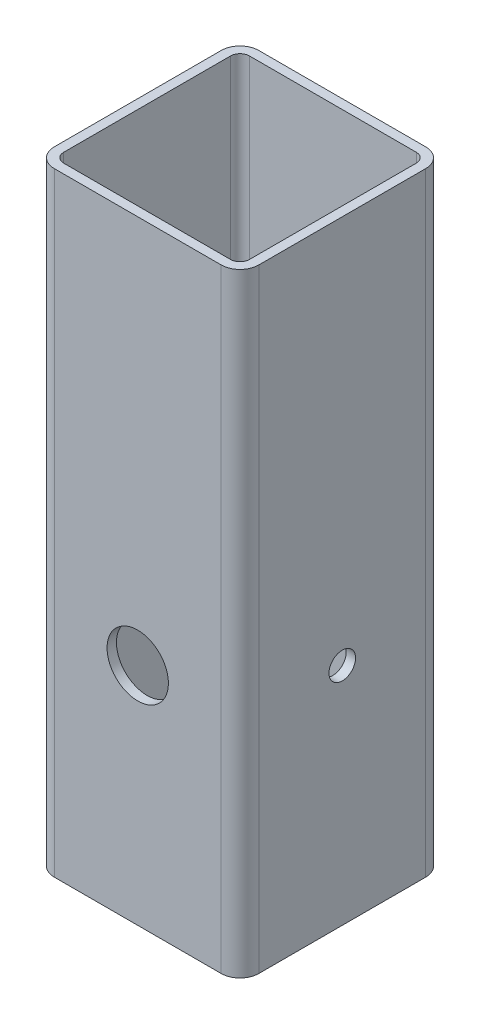
ISO-10303-21;
HEADER;
FILE_DESCRIPTION(('STEP AP214'),'2;1');
FILE_NAME('part.step','',(''),(''),'','','');
FILE_SCHEMA(('AUTOMOTIVE_DESIGN { 1 0 10303 214 1 1 1 1 }'));
ENDSEC;
DATA;
#1=APPLICATION_CONTEXT('core data for automotive mechanical design processes');
#2=APPLICATION_PROTOCOL_DEFINITION('international standard','automotive_design',2000,#1);
#3=PRODUCT_CONTEXT('',#1,'mechanical');
#4=PRODUCT('Part','Part','',(#3));
#5=PRODUCT_RELATED_PRODUCT_CATEGORY('part','',(#4));
#6=PRODUCT_DEFINITION_FORMATION('','',#4);
#7=PRODUCT_DEFINITION_CONTEXT('part definition',#1,'design');
#8=PRODUCT_DEFINITION('design','',#6,#7);
#9=PRODUCT_DEFINITION_SHAPE('','',#8);
#10=(LENGTH_UNIT() NAMED_UNIT(*) SI_UNIT(.MILLI.,.METRE.));
#11=(NAMED_UNIT(*) PLANE_ANGLE_UNIT() SI_UNIT($,.RADIAN.));
#12=(NAMED_UNIT(*) SI_UNIT($,.STERADIAN.) SOLID_ANGLE_UNIT());
#13=UNCERTAINTY_MEASURE_WITH_UNIT(LENGTH_MEASURE(1.E-05),#10,'distance_accuracy_value','');
#14=(GEOMETRIC_REPRESENTATION_CONTEXT(3) GLOBAL_UNCERTAINTY_ASSIGNED_CONTEXT((#13)) GLOBAL_UNIT_ASSIGNED_CONTEXT((#10,
#11,#12)) REPRESENTATION_CONTEXT('',''));
#15=CARTESIAN_POINT('',(0.,0.,0.));
#16=DIRECTION('',(0.,0.,1.));
#17=DIRECTION('',(1.,0.,0.));
#18=AXIS2_PLACEMENT_3D('',#15,#16,#17);
#19=CARTESIAN_POINT('',(20.4,75.,-20.4));
#20=DIRECTION('',(0.,-1.,0.));
#21=DIRECTION('',(0.,0.,-1.));
#22=AXIS2_PLACEMENT_3D('',#19,#20,#21);
#23=CYLINDRICAL_SURFACE('',#22,2.3);
#24=CARTESIAN_POINT('',(20.4,-75.,-20.4));
#25=DIRECTION('',(0.,1.,0.));
#26=DIRECTION('',(0.,0.,-1.));
#27=AXIS2_PLACEMENT_3D('',#24,#25,#26);
#28=CIRCLE('',#27,2.3);
#29=CARTESIAN_POINT('',(22.7,-75.,-20.4));
#30=VERTEX_POINT('',#29);
#31=CARTESIAN_POINT('',(20.4,-75.,-22.7));
#32=VERTEX_POINT('',#31);
#33=EDGE_CURVE('E229',#30,#32,#28,.T.);
#34=ORIENTED_EDGE('',*,*,#33,.F.);
#35=DIRECTION('',(0.,-1.,0.));
#36=VECTOR('',#35,1.);
#37=CARTESIAN_POINT('',(22.7,75.,-20.4));
#38=LINE('',#37,#36);
#39=CARTESIAN_POINT('',(22.7,75.,-20.4));
#40=VERTEX_POINT('',#39);
#41=EDGE_CURVE('E12',#40,#30,#38,.T.);
#42=ORIENTED_EDGE('',*,*,#41,.F.);
#43=CARTESIAN_POINT('',(20.4,75.,-20.4));
#44=DIRECTION('',(0.,1.,0.));
#45=DIRECTION('',(0.,0.,-1.));
#46=AXIS2_PLACEMENT_3D('',#43,#44,#45);
#47=CIRCLE('',#46,2.3);
#48=CARTESIAN_POINT('',(20.4,75.,-22.7));
#49=VERTEX_POINT('',#48);
#50=EDGE_CURVE('E316',#40,#49,#47,.T.);
#51=ORIENTED_EDGE('',*,*,#50,.T.);
#52=DIRECTION('',(0.,-1.,0.));
#53=VECTOR('',#52,1.);
#54=CARTESIAN_POINT('',(20.4,75.,-22.7));
#55=LINE('',#54,#53);
#56=EDGE_CURVE('E80',#49,#32,#55,.T.);
#57=ORIENTED_EDGE('',*,*,#56,.T.);
#58=EDGE_LOOP('',(#34,#42,#51,#57));
#59=FACE_BOUND('',#58,.T.);
#60=ADVANCED_FACE('F61',(#59),#23,.F.);
#61=CARTESIAN_POINT('',(22.7,75.,-20.4));
#62=DIRECTION('',(-1.,0.,0.));
#63=DIRECTION('',(0.,0.,1.));
#64=AXIS2_PLACEMENT_3D('',#61,#62,#63);
#65=PLANE('',#64);
#66=CARTESIAN_POINT('',(22.7,-20.,0.));
#67=DIRECTION('',(-1.,0.,0.));
#68=DIRECTION('',(0.,0.,1.));
#69=AXIS2_PLACEMENT_3D('',#66,#67,#68);
#70=CIRCLE('',#69,3.25);
#71=CARTESIAN_POINT('',(22.7,-20.,3.25));
#72=VERTEX_POINT('',#71);
#73=EDGE_CURVE('E215',#72,#72,#70,.T.);
#74=ORIENTED_EDGE('',*,*,#73,.F.);
#75=EDGE_LOOP('',(#74));
#76=FACE_BOUND('',#75,.T.);
#77=DIRECTION('',(0.,0.,-1.));
#78=VECTOR('',#77,1.);
#79=CARTESIAN_POINT('',(22.7,-75.,-20.4));
#80=LINE('',#79,#78);
#81=CARTESIAN_POINT('',(22.7,-75.,20.4));
#82=VERTEX_POINT('',#81);
#83=EDGE_CURVE('E231',#82,#30,#80,.T.);
#84=ORIENTED_EDGE('',*,*,#83,.F.);
#85=DIRECTION('',(0.,-1.,0.));
#86=VECTOR('',#85,1.);
#87=CARTESIAN_POINT('',(22.7,75.,20.4));
#88=LINE('',#87,#86);
#89=CARTESIAN_POINT('',(22.7,75.,20.4));
#90=VERTEX_POINT('',#89);
#91=EDGE_CURVE('E71',#90,#82,#88,.T.);
#92=ORIENTED_EDGE('',*,*,#91,.F.);
#93=DIRECTION('',(0.,0.,-1.));
#94=VECTOR('',#93,1.);
#95=CARTESIAN_POINT('',(22.7,75.,-20.4));
#96=LINE('',#95,#94);
#97=EDGE_CURVE('E318',#90,#40,#96,.T.);
#98=ORIENTED_EDGE('',*,*,#97,.T.);
#99=ORIENTED_EDGE('',*,*,#41,.T.);
#100=EDGE_LOOP('',(#84,#92,#98,#99));
#101=FACE_BOUND('',#100,.T.);
#102=ADVANCED_FACE('F349',(#76,#101),#65,.T.);
#103=CARTESIAN_POINT('',(20.4,75.,20.4));
#104=DIRECTION('',(0.,-1.,0.));
#105=DIRECTION('',(0.,0.,-1.));
#106=AXIS2_PLACEMENT_3D('',#103,#104,#105);
#107=CYLINDRICAL_SURFACE('',#106,2.3);
#108=CARTESIAN_POINT('',(20.4,-75.,20.4));
#109=DIRECTION('',(0.,1.,0.));
#110=DIRECTION('',(0.,0.,-1.));
#111=AXIS2_PLACEMENT_3D('',#108,#109,#110);
#112=CIRCLE('',#111,2.3);
#113=CARTESIAN_POINT('',(20.4,-75.,22.7));
#114=VERTEX_POINT('',#113);
#115=EDGE_CURVE('E234',#114,#82,#112,.T.);
#116=ORIENTED_EDGE('',*,*,#115,.F.);
#117=DIRECTION('',(0.,-1.,0.));
#118=VECTOR('',#117,1.);
#119=CARTESIAN_POINT('',(20.4,75.,22.7));
#120=LINE('',#119,#118);
#121=CARTESIAN_POINT('',(20.4,75.,22.7));
#122=VERTEX_POINT('',#121);
#123=EDGE_CURVE('E256',#122,#114,#120,.T.);
#124=ORIENTED_EDGE('',*,*,#123,.F.);
#125=CARTESIAN_POINT('',(20.4,75.,20.4));
#126=DIRECTION('',(0.,1.,0.));
#127=DIRECTION('',(0.,0.,-1.));
#128=AXIS2_PLACEMENT_3D('',#125,#126,#127);
#129=CIRCLE('',#128,2.3);
#130=EDGE_CURVE('E321',#122,#90,#129,.T.);
#131=ORIENTED_EDGE('',*,*,#130,.T.);
#132=ORIENTED_EDGE('',*,*,#91,.T.);
#133=EDGE_LOOP('',(#116,#124,#131,#132));
#134=FACE_BOUND('',#133,.T.);
#135=ADVANCED_FACE('F355',(#134),#107,.F.);
#136=CARTESIAN_POINT('',(-20.4,75.,22.7));
#137=DIRECTION('',(0.,0.,-1.));
#138=DIRECTION('',(-1.,0.,0.));
#139=AXIS2_PLACEMENT_3D('',#136,#137,#138);
#140=PLANE('',#139);
#141=CARTESIAN_POINT('',(0.,-20.,22.7));
#142=DIRECTION('',(0.,0.,-1.));
#143=DIRECTION('',(-1.,0.,0.));
#144=AXIS2_PLACEMENT_3D('',#141,#142,#143);
#145=CIRCLE('',#144,7.5);
#146=CARTESIAN_POINT('',(-7.5,-20.,22.7));
#147=VERTEX_POINT('',#146);
#148=EDGE_CURVE('E384',#147,#147,#145,.T.);
#149=ORIENTED_EDGE('',*,*,#148,.F.);
#150=EDGE_LOOP('',(#149));
#151=FACE_BOUND('',#150,.T.);
#152=DIRECTION('',(1.,0.,0.));
#153=VECTOR('',#152,1.);
#154=CARTESIAN_POINT('',(-20.4,-75.,22.7));
#155=LINE('',#154,#153);
#156=CARTESIAN_POINT('',(-20.4,-75.,22.7));
#157=VERTEX_POINT('',#156);
#158=EDGE_CURVE('E237',#157,#114,#155,.T.);
#159=ORIENTED_EDGE('',*,*,#158,.F.);
#160=DIRECTION('',(0.,-1.,0.));
#161=VECTOR('',#160,1.);
#162=CARTESIAN_POINT('',(-20.4,75.,22.7));
#163=LINE('',#162,#161);
#164=CARTESIAN_POINT('',(-20.4,75.,22.7));
#165=VERTEX_POINT('',#164);
#166=EDGE_CURVE('E254',#165,#157,#163,.T.);
#167=ORIENTED_EDGE('',*,*,#166,.F.);
#168=DIRECTION('',(1.,0.,0.));
#169=VECTOR('',#168,1.);
#170=CARTESIAN_POINT('',(-20.4,75.,22.7));
#171=LINE('',#170,#169);
#172=EDGE_CURVE('E324',#165,#122,#171,.T.);
#173=ORIENTED_EDGE('',*,*,#172,.T.);
#174=ORIENTED_EDGE('',*,*,#123,.T.);
#175=EDGE_LOOP('',(#159,#167,#173,#174));
#176=FACE_BOUND('',#175,.T.);
#177=ADVANCED_FACE('F417',(#151,#176),#140,.T.);
#178=CARTESIAN_POINT('',(-20.4,75.,20.4));
#179=DIRECTION('',(0.,-1.,0.));
#180=DIRECTION('',(0.,0.,-1.));
#181=AXIS2_PLACEMENT_3D('',#178,#179,#180);
#182=CYLINDRICAL_SURFACE('',#181,2.3);
#183=CARTESIAN_POINT('',(-20.4,-75.,20.4));
#184=DIRECTION('',(0.,1.,0.));
#185=DIRECTION('',(0.,0.,1.));
#186=AXIS2_PLACEMENT_3D('',#183,#184,#185);
#187=CIRCLE('',#186,2.3);
#188=CARTESIAN_POINT('',(-22.7,-75.,20.4));
#189=VERTEX_POINT('',#188);
#190=EDGE_CURVE('E240',#189,#157,#187,.T.);
#191=ORIENTED_EDGE('',*,*,#190,.F.);
#192=DIRECTION('',(0.,-1.,0.));
#193=VECTOR('',#192,1.);
#194=CARTESIAN_POINT('',(-22.7,75.,20.4));
#195=LINE('',#194,#193);
#196=CARTESIAN_POINT('',(-22.7,75.,20.4));
#197=VERTEX_POINT('',#196);
#198=EDGE_CURVE('E191',#197,#189,#195,.T.);
#199=ORIENTED_EDGE('',*,*,#198,.F.);
#200=CARTESIAN_POINT('',(-20.4,75.,20.4));
#201=DIRECTION('',(0.,1.,0.));
#202=DIRECTION('',(0.,0.,1.));
#203=AXIS2_PLACEMENT_3D('',#200,#201,#202);
#204=CIRCLE('',#203,2.3);
#205=EDGE_CURVE('E202',#197,#165,#204,.T.);
#206=ORIENTED_EDGE('',*,*,#205,.T.);
#207=ORIENTED_EDGE('',*,*,#166,.T.);
#208=EDGE_LOOP('',(#191,#199,#206,#207));
#209=FACE_BOUND('',#208,.T.);
#210=ADVANCED_FACE('F328',(#209),#182,.F.);
#211=CARTESIAN_POINT('',(-22.7,75.,-20.4));
#212=DIRECTION('',(1.,0.,0.));
#213=DIRECTION('',(0.,0.,-1.));
#214=AXIS2_PLACEMENT_3D('',#211,#212,#213);
#215=PLANE('',#214);
#216=CARTESIAN_POINT('',(-22.7,-20.,0.));
#217=DIRECTION('',(1.,0.,0.));
#218=DIRECTION('',(0.,0.,-1.));
#219=AXIS2_PLACEMENT_3D('',#216,#217,#218);
#220=CIRCLE('',#219,7.5);
#221=CARTESIAN_POINT('',(-22.7,-20.,-7.5));
#222=VERTEX_POINT('',#221);
#223=EDGE_CURVE('E605',#222,#222,#220,.T.);
#224=ORIENTED_EDGE('',*,*,#223,.F.);
#225=EDGE_LOOP('',(#224));
#226=FACE_BOUND('',#225,.T.);
#227=DIRECTION('',(0.,0.,1.));
#228=VECTOR('',#227,1.);
#229=CARTESIAN_POINT('',(-22.7,-75.,-20.4));
#230=LINE('',#229,#228);
#231=CARTESIAN_POINT('',(-22.7,-75.,-20.4));
#232=VERTEX_POINT('',#231);
#233=EDGE_CURVE('E187',#232,#189,#230,.T.);
#234=ORIENTED_EDGE('',*,*,#233,.F.);
#235=DIRECTION('',(0.,-1.,0.));
#236=VECTOR('',#235,1.);
#237=CARTESIAN_POINT('',(-22.7,75.,-20.4));
#238=LINE('',#237,#236);
#239=CARTESIAN_POINT('',(-22.7,75.,-20.4));
#240=VERTEX_POINT('',#239);
#241=EDGE_CURVE('E182',#240,#232,#238,.T.);
#242=ORIENTED_EDGE('',*,*,#241,.F.);
#243=DIRECTION('',(0.,0.,1.));
#244=VECTOR('',#243,1.);
#245=CARTESIAN_POINT('',(-22.7,75.,-20.4));
#246=LINE('',#245,#244);
#247=EDGE_CURVE('E185',#240,#197,#246,.T.);
#248=ORIENTED_EDGE('',*,*,#247,.T.);
#249=ORIENTED_EDGE('',*,*,#198,.T.);
#250=EDGE_LOOP('',(#234,#242,#248,#249));
#251=FACE_BOUND('',#250,.T.);
#252=ADVANCED_FACE('F184',(#226,#251),#215,.T.);
#253=CARTESIAN_POINT('',(-20.4,75.,-20.4));
#254=DIRECTION('',(0.,-1.,0.));
#255=DIRECTION('',(0.,0.,-1.));
#256=AXIS2_PLACEMENT_3D('',#253,#254,#255);
#257=CYLINDRICAL_SURFACE('',#256,2.3);
#258=CARTESIAN_POINT('',(-20.4,-75.,-20.4));
#259=DIRECTION('',(0.,1.,0.));
#260=DIRECTION('',(0.,0.,-1.));
#261=AXIS2_PLACEMENT_3D('',#258,#259,#260);
#262=CIRCLE('',#261,2.3);
#263=CARTESIAN_POINT('',(-20.4,-75.,-22.7));
#264=VERTEX_POINT('',#263);
#265=EDGE_CURVE('E244',#264,#232,#262,.T.);
#266=ORIENTED_EDGE('',*,*,#265,.F.);
#267=DIRECTION('',(0.,-1.,0.));
#268=VECTOR('',#267,1.);
#269=CARTESIAN_POINT('',(-20.4,75.,-22.7));
#270=LINE('',#269,#268);
#271=CARTESIAN_POINT('',(-20.4,75.,-22.7));
#272=VERTEX_POINT('',#271);
#273=EDGE_CURVE('E129',#272,#264,#270,.T.);
#274=ORIENTED_EDGE('',*,*,#273,.F.);
#275=CARTESIAN_POINT('',(-20.4,75.,-20.4));
#276=DIRECTION('',(0.,1.,0.));
#277=DIRECTION('',(0.,0.,-1.));
#278=AXIS2_PLACEMENT_3D('',#275,#276,#277);
#279=CIRCLE('',#278,2.3);
#280=EDGE_CURVE('E199',#272,#240,#279,.T.);
#281=ORIENTED_EDGE('',*,*,#280,.T.);
#282=ORIENTED_EDGE('',*,*,#241,.T.);
#283=EDGE_LOOP('',(#266,#274,#281,#282));
#284=FACE_BOUND('',#283,.T.);
#285=ADVANCED_FACE('F204',(#284),#257,.F.);
#286=CARTESIAN_POINT('',(20.4,75.,-20.4));
#287=DIRECTION('',(0.,-1.,0.));
#288=DIRECTION('',(0.,0.,-1.));
#289=AXIS2_PLACEMENT_3D('',#286,#287,#288);
#290=CYLINDRICAL_SURFACE('',#289,4.6);
#291=CARTESIAN_POINT('',(20.4,-75.,-20.4));
#292=DIRECTION('',(0.,1.,0.));
#293=DIRECTION('',(0.,0.,-1.));
#294=AXIS2_PLACEMENT_3D('',#291,#292,#293);
#295=CIRCLE('',#294,4.6);
#296=CARTESIAN_POINT('',(25.,-75.,-20.4));
#297=VERTEX_POINT('',#296);
#298=CARTESIAN_POINT('',(20.4,-75.,-25.));
#299=VERTEX_POINT('',#298);
#300=EDGE_CURVE('E211',#297,#299,#295,.T.);
#301=ORIENTED_EDGE('',*,*,#300,.T.);
#302=DIRECTION('',(0.,-1.,0.));
#303=VECTOR('',#302,1.);
#304=CARTESIAN_POINT('',(20.4,75.,-25.));
#305=LINE('',#304,#303);
#306=CARTESIAN_POINT('',(20.4,75.,-25.));
#307=VERTEX_POINT('',#306);
#308=EDGE_CURVE('E251',#307,#299,#305,.T.);
#309=ORIENTED_EDGE('',*,*,#308,.F.);
#310=CARTESIAN_POINT('',(20.4,75.,-20.4));
#311=DIRECTION('',(0.,1.,0.));
#312=DIRECTION('',(0.,0.,-1.));
#313=AXIS2_PLACEMENT_3D('',#310,#311,#312);
#314=CIRCLE('',#313,4.6);
#315=CARTESIAN_POINT('',(25.,75.,-20.4));
#316=VERTEX_POINT('',#315);
#317=EDGE_CURVE('E249',#316,#307,#314,.T.);
#318=ORIENTED_EDGE('',*,*,#317,.F.);
#319=DIRECTION('',(0.,-1.,0.));
#320=VECTOR('',#319,1.);
#321=CARTESIAN_POINT('',(25.,75.,-20.4));
#322=LINE('',#321,#320);
#323=EDGE_CURVE('E207',#316,#297,#322,.T.);
#324=ORIENTED_EDGE('',*,*,#323,.T.);
#325=EDGE_LOOP('',(#301,#309,#318,#324));
#326=FACE_BOUND('',#325,.T.);
#327=ADVANCED_FACE('F63',(#326),#290,.T.);
#328=CARTESIAN_POINT('',(-20.4,75.,-25.));
#329=DIRECTION('',(0.,0.,1.));
#330=DIRECTION('',(1.,0.,0.));
#331=AXIS2_PLACEMENT_3D('',#328,#329,#330);
#332=PLANE('',#331);
#333=CARTESIAN_POINT('',(0.,-20.,-25.));
#334=DIRECTION('',(0.,0.,-1.));
#335=DIRECTION('',(-1.,0.,0.));
#336=AXIS2_PLACEMENT_3D('',#333,#334,#335);
#337=CIRCLE('',#336,3.25);
#338=CARTESIAN_POINT('',(-3.25,-20.,-25.));
#339=VERTEX_POINT('',#338);
#340=EDGE_CURVE('E382',#339,#339,#337,.T.);
#341=ORIENTED_EDGE('',*,*,#340,.F.);
#342=EDGE_LOOP('',(#341));
#343=FACE_BOUND('',#342,.T.);
#344=DIRECTION('',(-1.,0.,0.));
#345=VECTOR('',#344,1.);
#346=CARTESIAN_POINT('',(-20.4,-75.,-25.));
#347=LINE('',#346,#345);
#348=CARTESIAN_POINT('',(-20.4,-75.,-25.));
#349=VERTEX_POINT('',#348);
#350=EDGE_CURVE('E214',#299,#349,#347,.T.);
#351=ORIENTED_EDGE('',*,*,#350,.T.);
#352=DIRECTION('',(0.,-1.,0.));
#353=VECTOR('',#352,1.);
#354=CARTESIAN_POINT('',(-20.4,75.,-25.));
#355=LINE('',#354,#353);
#356=CARTESIAN_POINT('',(-20.4,75.,-25.));
#357=VERTEX_POINT('',#356);
#358=EDGE_CURVE('E276',#357,#349,#355,.T.);
#359=ORIENTED_EDGE('',*,*,#358,.F.);
#360=DIRECTION('',(-1.,0.,0.));
#361=VECTOR('',#360,1.);
#362=CARTESIAN_POINT('',(-20.4,75.,-25.));
#363=LINE('',#362,#361);
#364=EDGE_CURVE('E142',#307,#357,#363,.T.);
#365=ORIENTED_EDGE('',*,*,#364,.F.);
#366=ORIENTED_EDGE('',*,*,#308,.T.);
#367=EDGE_LOOP('',(#351,#359,#365,#366));
#368=FACE_BOUND('',#367,.T.);
#369=ADVANCED_FACE('F279',(#343,#368),#332,.F.);
#370=CARTESIAN_POINT('',(-20.4,75.,-20.4));
#371=DIRECTION('',(0.,-1.,0.));
#372=DIRECTION('',(0.,0.,-1.));
#373=AXIS2_PLACEMENT_3D('',#370,#371,#372);
#374=CYLINDRICAL_SURFACE('',#373,4.6);
#375=CARTESIAN_POINT('',(-20.4,-75.,-20.4));
#376=DIRECTION('',(0.,1.,0.));
#377=DIRECTION('',(0.,0.,-1.));
#378=AXIS2_PLACEMENT_3D('',#375,#376,#377);
#379=CIRCLE('',#378,4.6);
#380=CARTESIAN_POINT('',(-25.,-75.,-20.4));
#381=VERTEX_POINT('',#380);
#382=EDGE_CURVE('E217',#349,#381,#379,.T.);
#383=ORIENTED_EDGE('',*,*,#382,.T.);
#384=DIRECTION('',(0.,-1.,0.));
#385=VECTOR('',#384,1.);
#386=CARTESIAN_POINT('',(-25.,75.,-20.4));
#387=LINE('',#386,#385);
#388=CARTESIAN_POINT('',(-25.,75.,-20.4));
#389=VERTEX_POINT('',#388);
#390=EDGE_CURVE('E273',#389,#381,#387,.T.);
#391=ORIENTED_EDGE('',*,*,#390,.F.);
#392=CARTESIAN_POINT('',(-20.4,75.,-20.4));
#393=DIRECTION('',(0.,1.,0.));
#394=DIRECTION('',(0.,0.,-1.));
#395=AXIS2_PLACEMENT_3D('',#392,#393,#394);
#396=CIRCLE('',#395,4.6);
#397=EDGE_CURVE('E304',#357,#389,#396,.T.);
#398=ORIENTED_EDGE('',*,*,#397,.F.);
#399=ORIENTED_EDGE('',*,*,#358,.T.);
#400=EDGE_LOOP('',(#383,#391,#398,#399));
#401=FACE_BOUND('',#400,.T.);
#402=ADVANCED_FACE('F294',(#401),#374,.T.);
#403=CARTESIAN_POINT('',(-25.,75.,-20.4));
#404=DIRECTION('',(1.,0.,0.));
#405=DIRECTION('',(0.,0.,-1.));
#406=AXIS2_PLACEMENT_3D('',#403,#404,#405);
#407=PLANE('',#406);
#408=CARTESIAN_POINT('',(-25.,-20.,0.));
#409=DIRECTION('',(-1.,0.,0.));
#410=DIRECTION('',(0.,0.,1.));
#411=AXIS2_PLACEMENT_3D('',#408,#409,#410);
#412=CIRCLE('',#411,7.5);
#413=CARTESIAN_POINT('',(-25.,-20.,7.5));
#414=VERTEX_POINT('',#413);
#415=EDGE_CURVE('E608',#414,#414,#412,.T.);
#416=ORIENTED_EDGE('',*,*,#415,.F.);
#417=EDGE_LOOP('',(#416));
#418=FACE_BOUND('',#417,.T.);
#419=DIRECTION('',(0.,0.,1.));
#420=VECTOR('',#419,1.);
#421=CARTESIAN_POINT('',(-25.,-75.,-20.4));
#422=LINE('',#421,#420);
#423=CARTESIAN_POINT('',(-25.,-75.,20.4));
#424=VERTEX_POINT('',#423);
#425=EDGE_CURVE('E219',#381,#424,#422,.T.);
#426=ORIENTED_EDGE('',*,*,#425,.T.);
#427=DIRECTION('',(0.,-1.,0.));
#428=VECTOR('',#427,1.);
#429=CARTESIAN_POINT('',(-25.,75.,20.4));
#430=LINE('',#429,#428);
#431=CARTESIAN_POINT('',(-25.,75.,20.4));
#432=VERTEX_POINT('',#431);
#433=EDGE_CURVE('E270',#432,#424,#430,.T.);
#434=ORIENTED_EDGE('',*,*,#433,.F.);
#435=DIRECTION('',(0.,0.,1.));
#436=VECTOR('',#435,1.);
#437=CARTESIAN_POINT('',(-25.,75.,-20.4));
#438=LINE('',#437,#436);
#439=EDGE_CURVE('E300',#389,#432,#438,.T.);
#440=ORIENTED_EDGE('',*,*,#439,.F.);
#441=ORIENTED_EDGE('',*,*,#390,.T.);
#442=EDGE_LOOP('',(#426,#434,#440,#441));
#443=FACE_BOUND('',#442,.T.);
#444=ADVANCED_FACE('F298',(#418,#443),#407,.F.);
#445=CARTESIAN_POINT('',(-20.4,75.,20.4));
#446=DIRECTION('',(0.,-1.,0.));
#447=DIRECTION('',(0.,0.,-1.));
#448=AXIS2_PLACEMENT_3D('',#445,#446,#447);
#449=CYLINDRICAL_SURFACE('',#448,4.6);
#450=CARTESIAN_POINT('',(-20.4,-75.,20.4));
#451=DIRECTION('',(0.,1.,0.));
#452=DIRECTION('',(0.,0.,1.));
#453=AXIS2_PLACEMENT_3D('',#450,#451,#452);
#454=CIRCLE('',#453,4.6);
#455=CARTESIAN_POINT('',(-20.4,-75.,25.));
#456=VERTEX_POINT('',#455);
#457=EDGE_CURVE('E221',#424,#456,#454,.T.);
#458=ORIENTED_EDGE('',*,*,#457,.T.);
#459=DIRECTION('',(0.,-1.,0.));
#460=VECTOR('',#459,1.);
#461=CARTESIAN_POINT('',(-20.4,75.,25.));
#462=LINE('',#461,#460);
#463=CARTESIAN_POINT('',(-20.4,75.,25.));
#464=VERTEX_POINT('',#463);
#465=EDGE_CURVE('E267',#464,#456,#462,.T.);
#466=ORIENTED_EDGE('',*,*,#465,.F.);
#467=CARTESIAN_POINT('',(-20.4,75.,20.4));
#468=DIRECTION('',(0.,1.,0.));
#469=DIRECTION('',(0.,0.,1.));
#470=AXIS2_PLACEMENT_3D('',#467,#468,#469);
#471=CIRCLE('',#470,4.6);
#472=EDGE_CURVE('E303',#432,#464,#471,.T.);
#473=ORIENTED_EDGE('',*,*,#472,.F.);
#474=ORIENTED_EDGE('',*,*,#433,.T.);
#475=EDGE_LOOP('',(#458,#466,#473,#474));
#476=FACE_BOUND('',#475,.T.);
#477=ADVANCED_FACE('F366',(#476),#449,.T.);
#478=CARTESIAN_POINT('',(-20.4,75.,25.));
#479=DIRECTION('',(0.,0.,-1.));
#480=DIRECTION('',(-1.,0.,0.));
#481=AXIS2_PLACEMENT_3D('',#478,#479,#480);
#482=PLANE('',#481);
#483=CARTESIAN_POINT('',(0.,-20.,25.));
#484=DIRECTION('',(0.,0.,1.));
#485=DIRECTION('',(1.,0.,0.));
#486=AXIS2_PLACEMENT_3D('',#483,#484,#485);
#487=CIRCLE('',#486,7.5);
#488=CARTESIAN_POINT('',(7.5,-20.,25.));
#489=VERTEX_POINT('',#488);
#490=EDGE_CURVE('E389',#489,#489,#487,.T.);
#491=ORIENTED_EDGE('',*,*,#490,.F.);
#492=EDGE_LOOP('',(#491));
#493=FACE_BOUND('',#492,.T.);
#494=DIRECTION('',(1.,0.,0.));
#495=VECTOR('',#494,1.);
#496=CARTESIAN_POINT('',(-20.4,-75.,25.));
#497=LINE('',#496,#495);
#498=CARTESIAN_POINT('',(20.4,-75.,25.));
#499=VERTEX_POINT('',#498);
#500=EDGE_CURVE('E223',#456,#499,#497,.T.);
#501=ORIENTED_EDGE('',*,*,#500,.T.);
#502=DIRECTION('',(0.,-1.,0.));
#503=VECTOR('',#502,1.);
#504=CARTESIAN_POINT('',(20.4,75.,25.));
#505=LINE('',#504,#503);
#506=CARTESIAN_POINT('',(20.4,75.,25.));
#507=VERTEX_POINT('',#506);
#508=EDGE_CURVE('E264',#507,#499,#505,.T.);
#509=ORIENTED_EDGE('',*,*,#508,.F.);
#510=DIRECTION('',(1.,0.,0.));
#511=VECTOR('',#510,1.);
#512=CARTESIAN_POINT('',(-20.4,75.,25.));
#513=LINE('',#512,#511);
#514=EDGE_CURVE('E306',#464,#507,#513,.T.);
#515=ORIENTED_EDGE('',*,*,#514,.F.);
#516=ORIENTED_EDGE('',*,*,#465,.T.);
#517=EDGE_LOOP('',(#501,#509,#515,#516));
#518=FACE_BOUND('',#517,.T.);
#519=ADVANCED_FACE('F362',(#493,#518),#482,.F.);
#520=CARTESIAN_POINT('',(20.4,75.,20.4));
#521=DIRECTION('',(0.,-1.,0.));
#522=DIRECTION('',(0.,0.,-1.));
#523=AXIS2_PLACEMENT_3D('',#520,#521,#522);
#524=CYLINDRICAL_SURFACE('',#523,4.6);
#525=CARTESIAN_POINT('',(20.4,-75.,20.4));
#526=DIRECTION('',(0.,1.,0.));
#527=DIRECTION('',(0.,0.,-1.));
#528=AXIS2_PLACEMENT_3D('',#525,#526,#527);
#529=CIRCLE('',#528,4.6);
#530=CARTESIAN_POINT('',(25.,-75.,20.4));
#531=VERTEX_POINT('',#530);
#532=EDGE_CURVE('E225',#499,#531,#529,.T.);
#533=ORIENTED_EDGE('',*,*,#532,.T.);
#534=DIRECTION('',(0.,-1.,0.));
#535=VECTOR('',#534,1.);
#536=CARTESIAN_POINT('',(25.,75.,20.4));
#537=LINE('',#536,#535);
#538=CARTESIAN_POINT('',(25.,75.,20.4));
#539=VERTEX_POINT('',#538);
#540=EDGE_CURVE('E261',#539,#531,#537,.T.);
#541=ORIENTED_EDGE('',*,*,#540,.F.);
#542=CARTESIAN_POINT('',(20.4,75.,20.4));
#543=DIRECTION('',(0.,1.,0.));
#544=DIRECTION('',(0.,0.,-1.));
#545=AXIS2_PLACEMENT_3D('',#542,#543,#544);
#546=CIRCLE('',#545,4.6);
#547=EDGE_CURVE('E312',#507,#539,#546,.T.);
#548=ORIENTED_EDGE('',*,*,#547,.F.);
#549=ORIENTED_EDGE('',*,*,#508,.T.);
#550=EDGE_LOOP('',(#533,#541,#548,#549));
#551=FACE_BOUND('',#550,.T.);
#552=ADVANCED_FACE('F342',(#551),#524,.T.);
#553=CARTESIAN_POINT('',(25.,75.,-20.4));
#554=DIRECTION('',(-1.,0.,0.));
#555=DIRECTION('',(0.,0.,1.));
#556=AXIS2_PLACEMENT_3D('',#553,#554,#555);
#557=PLANE('',#556);
#558=CARTESIAN_POINT('',(25.,-20.,0.));
#559=DIRECTION('',(1.,0.,0.));
#560=DIRECTION('',(0.,0.,-1.));
#561=AXIS2_PLACEMENT_3D('',#558,#559,#560);
#562=CIRCLE('',#561,3.25);
#563=CARTESIAN_POINT('',(25.,-20.,-3.25));
#564=VERTEX_POINT('',#563);
#565=EDGE_CURVE('E387',#564,#564,#562,.T.);
#566=ORIENTED_EDGE('',*,*,#565,.F.);
#567=EDGE_LOOP('',(#566));
#568=FACE_BOUND('',#567,.T.);
#569=DIRECTION('',(0.,0.,-1.));
#570=VECTOR('',#569,1.);
#571=CARTESIAN_POINT('',(25.,-75.,-20.4));
#572=LINE('',#571,#570);
#573=EDGE_CURVE('E227',#531,#297,#572,.T.);
#574=ORIENTED_EDGE('',*,*,#573,.T.);
#575=ORIENTED_EDGE('',*,*,#323,.F.);
#576=DIRECTION('',(0.,0.,-1.));
#577=VECTOR('',#576,1.);
#578=CARTESIAN_POINT('',(25.,75.,-20.4));
#579=LINE('',#578,#577);
#580=EDGE_CURVE('E314',#539,#316,#579,.T.);
#581=ORIENTED_EDGE('',*,*,#580,.F.);
#582=ORIENTED_EDGE('',*,*,#540,.T.);
#583=EDGE_LOOP('',(#574,#575,#581,#582));
#584=FACE_BOUND('',#583,.T.);
#585=ADVANCED_FACE('F332',(#568,#584),#557,.F.);
#586=CARTESIAN_POINT('',(-20.4,75.,-22.7));
#587=DIRECTION('',(0.,0.,1.));
#588=DIRECTION('',(1.,0.,0.));
#589=AXIS2_PLACEMENT_3D('',#586,#587,#588);
#590=PLANE('',#589);
#591=CARTESIAN_POINT('',(0.,-20.,-22.7));
#592=DIRECTION('',(0.,0.,1.));
#593=DIRECTION('',(1.,0.,0.));
#594=AXIS2_PLACEMENT_3D('',#591,#592,#593);
#595=CIRCLE('',#594,3.25);
#596=CARTESIAN_POINT('',(3.25,-20.,-22.7));
#597=VERTEX_POINT('',#596);
#598=EDGE_CURVE('E65',#597,#597,#595,.T.);
#599=ORIENTED_EDGE('',*,*,#598,.F.);
#600=EDGE_LOOP('',(#599));
#601=FACE_BOUND('',#600,.T.);
#602=DIRECTION('',(-1.,0.,0.));
#603=VECTOR('',#602,1.);
#604=CARTESIAN_POINT('',(-20.4,-75.,-22.7));
#605=LINE('',#604,#603);
#606=EDGE_CURVE('E246',#32,#264,#605,.T.);
#607=ORIENTED_EDGE('',*,*,#606,.F.);
#608=ORIENTED_EDGE('',*,*,#56,.F.);
#609=DIRECTION('',(-1.,0.,0.));
#610=VECTOR('',#609,1.);
#611=CARTESIAN_POINT('',(-20.4,75.,-22.7));
#612=LINE('',#611,#610);
#613=EDGE_CURVE('E205',#49,#272,#612,.T.);
#614=ORIENTED_EDGE('',*,*,#613,.T.);
#615=ORIENTED_EDGE('',*,*,#273,.T.);
#616=EDGE_LOOP('',(#607,#608,#614,#615));
#617=FACE_BOUND('',#616,.T.);
#618=ADVANCED_FACE('F330',(#601,#617),#590,.T.);
#619=CARTESIAN_POINT('',(20.4,75.,-20.4));
#620=DIRECTION('',(0.,-1.,0.));
#621=DIRECTION('',(0.,0.,-1.));
#622=AXIS2_PLACEMENT_3D('',#619,#620,#621);
#623=PLANE('',#622);
#624=ORIENTED_EDGE('',*,*,#317,.T.);
#625=ORIENTED_EDGE('',*,*,#364,.T.);
#626=ORIENTED_EDGE('',*,*,#397,.T.);
#627=ORIENTED_EDGE('',*,*,#439,.T.);
#628=ORIENTED_EDGE('',*,*,#472,.T.);
#629=ORIENTED_EDGE('',*,*,#514,.T.);
#630=ORIENTED_EDGE('',*,*,#547,.T.);
#631=ORIENTED_EDGE('',*,*,#580,.T.);
#632=EDGE_LOOP('',(#624,#625,#626,#627,#628,#629,#630,#631));
#633=FACE_BOUND('',#632,.T.);
#634=ORIENTED_EDGE('',*,*,#50,.F.);
#635=ORIENTED_EDGE('',*,*,#97,.F.);
#636=ORIENTED_EDGE('',*,*,#130,.F.);
#637=ORIENTED_EDGE('',*,*,#172,.F.);
#638=ORIENTED_EDGE('',*,*,#205,.F.);
#639=ORIENTED_EDGE('',*,*,#247,.F.);
#640=ORIENTED_EDGE('',*,*,#280,.F.);
#641=ORIENTED_EDGE('',*,*,#613,.F.);
#642=EDGE_LOOP('',(#634,#635,#636,#637,#638,#639,#640,#641));
#643=FACE_BOUND('',#642,.T.);
#644=ADVANCED_FACE('F197',(#633,#643),#623,.F.);
#645=CARTESIAN_POINT('',(20.4,-75.,-20.4));
#646=DIRECTION('',(0.,-1.,0.));
#647=DIRECTION('',(0.,0.,-1.));
#648=AXIS2_PLACEMENT_3D('',#645,#646,#647);
#649=PLANE('',#648);
#650=ORIENTED_EDGE('',*,*,#300,.F.);
#651=ORIENTED_EDGE('',*,*,#573,.F.);
#652=ORIENTED_EDGE('',*,*,#532,.F.);
#653=ORIENTED_EDGE('',*,*,#500,.F.);
#654=ORIENTED_EDGE('',*,*,#457,.F.);
#655=ORIENTED_EDGE('',*,*,#425,.F.);
#656=ORIENTED_EDGE('',*,*,#382,.F.);
#657=ORIENTED_EDGE('',*,*,#350,.F.);
#658=EDGE_LOOP('',(#650,#651,#652,#653,#654,#655,#656,#657));
#659=FACE_BOUND('',#658,.T.);
#660=ORIENTED_EDGE('',*,*,#33,.T.);
#661=ORIENTED_EDGE('',*,*,#606,.T.);
#662=ORIENTED_EDGE('',*,*,#265,.T.);
#663=ORIENTED_EDGE('',*,*,#233,.T.);
#664=ORIENTED_EDGE('',*,*,#190,.T.);
#665=ORIENTED_EDGE('',*,*,#158,.T.);
#666=ORIENTED_EDGE('',*,*,#115,.T.);
#667=ORIENTED_EDGE('',*,*,#83,.T.);
#668=EDGE_LOOP('',(#660,#661,#662,#663,#664,#665,#666,#667));
#669=FACE_BOUND('',#668,.T.);
#670=ADVANCED_FACE('F286',(#659,#669),#649,.T.);
#671=CARTESIAN_POINT('',(15.,-20.,0.));
#672=DIRECTION('',(1.,0.,0.));
#673=DIRECTION('',(0.,0.,-1.));
#674=AXIS2_PLACEMENT_3D('',#671,#672,#673);
#675=CYLINDRICAL_SURFACE('',#674,3.25);
#676=ORIENTED_EDGE('',*,*,#73,.T.);
#677=EDGE_LOOP('',(#676));
#678=FACE_BOUND('',#677,.T.);
#679=ORIENTED_EDGE('',*,*,#565,.T.);
#680=EDGE_LOOP('',(#679));
#681=FACE_BOUND('',#680,.T.);
#682=ADVANCED_FACE('F408',(#678,#681),#675,.F.);
#683=CARTESIAN_POINT('',(0.,-20.,-15.));
#684=DIRECTION('',(0.,0.,-1.));
#685=DIRECTION('',(-1.,0.,0.));
#686=AXIS2_PLACEMENT_3D('',#683,#684,#685);
#687=CYLINDRICAL_SURFACE('',#686,3.25);
#688=ORIENTED_EDGE('',*,*,#598,.T.);
#689=EDGE_LOOP('',(#688));
#690=FACE_BOUND('',#689,.T.);
#691=ORIENTED_EDGE('',*,*,#340,.T.);
#692=EDGE_LOOP('',(#691));
#693=FACE_BOUND('',#692,.T.);
#694=ADVANCED_FACE('F500',(#690,#693),#687,.F.);
#695=CARTESIAN_POINT('',(0.,-20.,15.));
#696=DIRECTION('',(0.,0.,1.));
#697=DIRECTION('',(1.,0.,0.));
#698=AXIS2_PLACEMENT_3D('',#695,#696,#697);
#699=CYLINDRICAL_SURFACE('',#698,7.5);
#700=ORIENTED_EDGE('',*,*,#148,.T.);
#701=EDGE_LOOP('',(#700));
#702=FACE_BOUND('',#701,.T.);
#703=ORIENTED_EDGE('',*,*,#490,.T.);
#704=EDGE_LOOP('',(#703));
#705=FACE_BOUND('',#704,.T.);
#706=ADVANCED_FACE('F506',(#702,#705),#699,.F.);
#707=CARTESIAN_POINT('',(-15.,-20.,0.));
#708=DIRECTION('',(-1.,0.,0.));
#709=DIRECTION('',(0.,0.,1.));
#710=AXIS2_PLACEMENT_3D('',#707,#708,#709);
#711=CYLINDRICAL_SURFACE('',#710,7.5);
#712=ORIENTED_EDGE('',*,*,#223,.T.);
#713=EDGE_LOOP('',(#712));
#714=FACE_BOUND('',#713,.T.);
#715=ORIENTED_EDGE('',*,*,#415,.T.);
#716=EDGE_LOOP('',(#715));
#717=FACE_BOUND('',#716,.T.);
#718=ADVANCED_FACE('F513',(#714,#717),#711,.F.);
#719=CLOSED_SHELL('',(#60,#102,#135,#177,#210,#252,#285,#327,#369,#402,#444,#477,#519,#552,#585,
#618,#644,#670,#682,#694,#706,#718));
#720=MANIFOLD_SOLID_BREP('B2',#719);
#721=ADVANCED_BREP_SHAPE_REPRESENTATION('',(#18,#720),#14);
#722=SHAPE_DEFINITION_REPRESENTATION(#9,#721);
ENDSEC;
END-ISO-10303-21;
